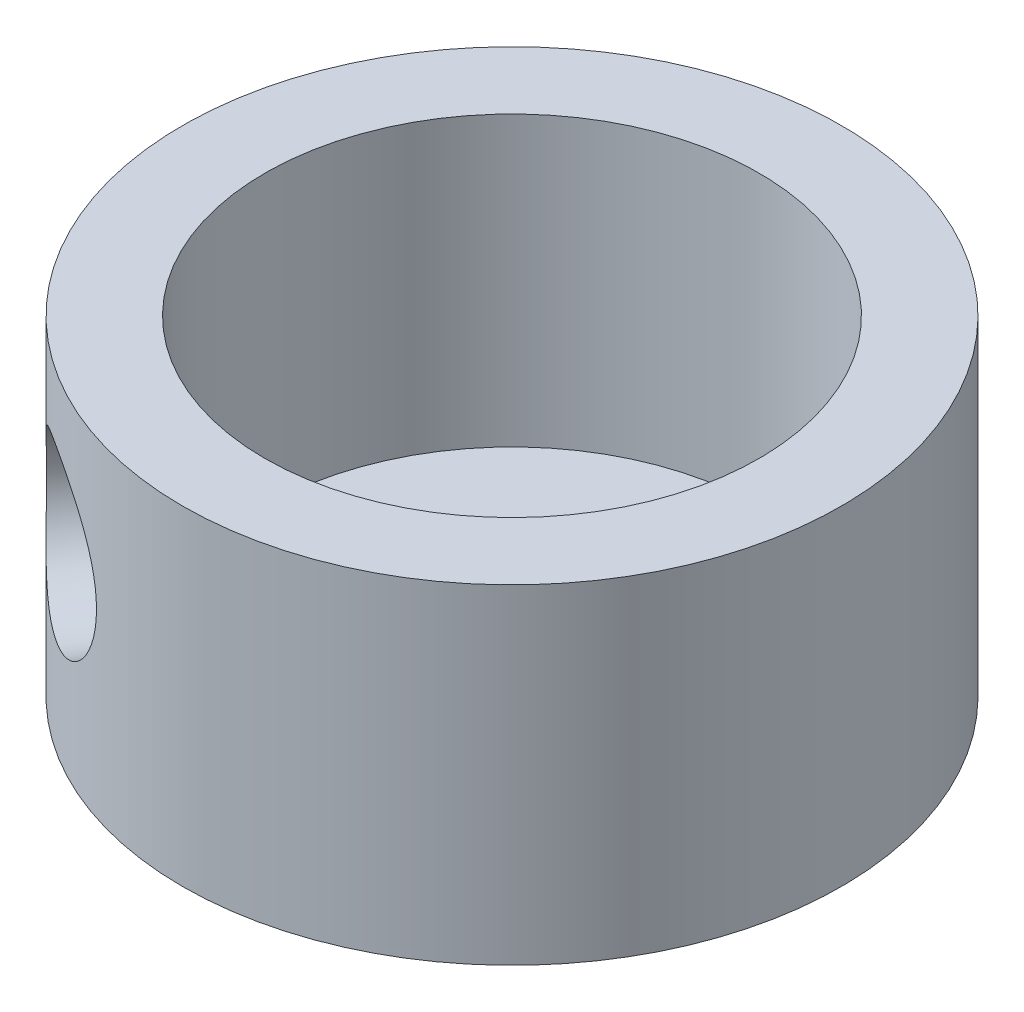
ISO-10303-21;
HEADER;
FILE_DESCRIPTION(('STEP AP214'),'2;1');
FILE_NAME('part.step','',(''),(''),'','','');
FILE_SCHEMA(('AUTOMOTIVE_DESIGN { 1 0 10303 214 1 1 1 1 }'));
ENDSEC;
DATA;
#1=APPLICATION_CONTEXT('core data for automotive mechanical design processes');
#2=APPLICATION_PROTOCOL_DEFINITION('international standard','automotive_design',2000,#1);
#3=PRODUCT_CONTEXT('',#1,'mechanical');
#4=PRODUCT('Part','Part','',(#3));
#5=PRODUCT_RELATED_PRODUCT_CATEGORY('part','',(#4));
#6=PRODUCT_DEFINITION_FORMATION('','',#4);
#7=PRODUCT_DEFINITION_CONTEXT('part definition',#1,'design');
#8=PRODUCT_DEFINITION('design','',#6,#7);
#9=PRODUCT_DEFINITION_SHAPE('','',#8);
#10=(LENGTH_UNIT() NAMED_UNIT(*) SI_UNIT(.MILLI.,.METRE.));
#11=(NAMED_UNIT(*) PLANE_ANGLE_UNIT() SI_UNIT($,.RADIAN.));
#12=(NAMED_UNIT(*) SI_UNIT($,.STERADIAN.) SOLID_ANGLE_UNIT());
#13=UNCERTAINTY_MEASURE_WITH_UNIT(LENGTH_MEASURE(1.E-05),#10,'distance_accuracy_value','');
#14=(GEOMETRIC_REPRESENTATION_CONTEXT(3) GLOBAL_UNCERTAINTY_ASSIGNED_CONTEXT((#13)) GLOBAL_UNIT_ASSIGNED_CONTEXT((#10,
#11,#12)) REPRESENTATION_CONTEXT('',''));
#15=CARTESIAN_POINT('',(0.,0.,0.));
#16=DIRECTION('',(0.,0.,1.));
#17=DIRECTION('',(1.,0.,0.));
#18=AXIS2_PLACEMENT_3D('',#15,#16,#17);
#19=CARTESIAN_POINT('',(0.,40.,0.));
#20=DIRECTION('',(0.,-1.,0.));
#21=DIRECTION('',(0.,0.,-1.));
#22=AXIS2_PLACEMENT_3D('',#19,#20,#21);
#23=CYLINDRICAL_SURFACE('',#22,40.);
#24=CARTESIAN_POINT('',(-12.415558049306,21.9418173695324,38.0243858375689));
#25=CARTESIAN_POINT('',(-12.4155594019558,21.6590399606591,38.024385824656));
#26=CARTESIAN_POINT('',(-12.427079223235,21.376240105265,38.0206299008439));
#27=CARTESIAN_POINT('',(-12.4730260124529,20.8126929271854,38.0055811007373));
#28=CARTESIAN_POINT('',(-12.5074554293318,20.5319458271749,37.9942874186875));
#29=CARTESIAN_POINT('',(-12.5988361564139,19.9744217554529,37.9640835670639));
#30=CARTESIAN_POINT('',(-12.6557980052463,19.6976467043668,37.945169833444));
#31=CARTESIAN_POINT('',(-12.7915879181901,19.1501618869632,37.8996094838355));
#32=CARTESIAN_POINT('',(-12.8704165418517,18.8794522760463,37.8729626699637));
#33=CARTESIAN_POINT('',(-13.0489388759586,18.346338890214,37.8118245383458));
#34=CARTESIAN_POINT('',(-13.1486037211899,18.0839241970142,37.7773440671934));
#35=CARTESIAN_POINT('',(-13.3678065925695,17.5687586196163,37.7003346469411));
#36=CARTESIAN_POINT('',(-13.487344713083,17.3160077813125,37.6578056596238));
#37=CARTESIAN_POINT('',(-13.7450691457293,16.8218384424075,37.5645024376086));
#38=CARTESIAN_POINT('',(-13.8832528767622,16.580418379518,37.5137293439394));
#39=CARTESIAN_POINT('',(-14.1770036319947,16.1103180981837,37.4037052401701));
#40=CARTESIAN_POINT('',(-14.3325764192147,15.8816421411985,37.3444514175807));
#41=CARTESIAN_POINT('',(-14.6630368258013,15.4339465137954,37.2159564763509));
#42=CARTESIAN_POINT('',(-14.8382576138213,15.2152247331983,37.146534002738));
#43=CARTESIAN_POINT('',(-15.2036988504105,14.7940372077944,36.9984648293445));
#44=CARTESIAN_POINT('',(-15.3939194680408,14.5915716462611,36.9198180255927));
#45=CARTESIAN_POINT('',(-15.7877471353374,14.2041698809787,36.7531326951415));
#46=CARTESIAN_POINT('',(-15.9913578206036,14.0192384715667,36.6650916136847));
#47=CARTESIAN_POINT('',(-16.4101096230142,13.6682740600851,36.4795931386337));
#48=CARTESIAN_POINT('',(-16.6252466706628,13.5022344519136,36.382139058762));
#49=CARTESIAN_POINT('',(-17.068609899895,13.18780542268,36.1762790752024));
#50=CARTESIAN_POINT('',(-17.2969835423152,13.0397165135677,36.0677313896055));
#51=CARTESIAN_POINT('',(-17.7618872048861,12.7652362770315,35.8410690588175));
#52=CARTESIAN_POINT('',(-17.9984173294578,12.6388452275117,35.7229542911206));
#53=CARTESIAN_POINT('',(-18.4776036586333,12.4087760698445,35.4774663042957));
#54=CARTESIAN_POINT('',(-18.7202591245734,12.3050952374945,35.3500941980752));
#55=CARTESIAN_POINT('',(-19.209675688444,12.1212903963853,35.0865443154229));
#56=CARTESIAN_POINT('',(-19.4564366858053,12.0411658114867,34.9503667544547));
#57=CARTESIAN_POINT('',(-19.9467336690578,11.9066098239185,34.6728348559678));
#58=CARTESIAN_POINT('',(-20.190226874615,11.851668979168,34.531651842159));
#59=CARTESIAN_POINT('',(-20.6772330186998,11.7654877838205,34.2422583409081));
#60=CARTESIAN_POINT('',(-20.9207459569345,11.7342471296421,34.0940479435072));
#61=CARTESIAN_POINT('',(-21.4058594618598,11.6957430998773,33.791579944348));
#62=CARTESIAN_POINT('',(-21.6474602820483,11.6884764909653,33.6373231608919));
#63=CARTESIAN_POINT('',(-22.1269515595027,11.697976277523,33.3238661051776));
#64=CARTESIAN_POINT('',(-22.3648420652796,11.714742358507,33.1646658976343));
#65=CARTESIAN_POINT('',(-22.8296912331943,11.7714865615309,32.846349876943));
#66=CARTESIAN_POINT('',(-23.0567754522229,11.8109137597068,32.68731882579));
#67=CARTESIAN_POINT('',(-23.5042655720258,11.9122192033553,32.3670388971039));
#68=CARTESIAN_POINT('',(-23.7246715944038,11.9740970397557,32.2057900600325));
#69=CARTESIAN_POINT('',(-24.157462349507,12.1198049321382,31.8824401309598));
#70=CARTESIAN_POINT('',(-24.3698468116334,12.2036357279238,31.7203390104175));
#71=CARTESIAN_POINT('',(-24.7853844276538,12.3925941893316,31.3967208213953));
#72=CARTESIAN_POINT('',(-24.9885374448385,12.4977221702199,31.2352037615976));
#73=CARTESIAN_POINT('',(-25.3863704114685,12.7295467767607,30.9127540813596));
#74=CARTESIAN_POINT('',(-25.580955575286,12.8564323543292,30.7518404033818));
#75=CARTESIAN_POINT('',(-25.9587773131162,13.1302188347266,30.4335821563262));
#76=CARTESIAN_POINT('',(-26.1420096394612,13.2771271640767,30.2762389369247));
#77=CARTESIAN_POINT('',(-26.4961994554797,13.589864622714,29.9667601859793));
#78=CARTESIAN_POINT('',(-26.6671600334844,13.7556889641705,29.8146233492661));
#79=CARTESIAN_POINT('',(-26.9962465907019,14.1052654857866,29.5169769115408));
#80=CARTESIAN_POINT('',(-27.154366634197,14.2890258716803,29.3714703889715));
#81=CARTESIAN_POINT('',(-27.4614067566622,14.6787015029998,29.08464419284));
#82=CARTESIAN_POINT('',(-27.6099373688576,14.8850981540838,28.9435612338078));
#83=CARTESIAN_POINT('',(-27.8920985323562,15.3140800578754,28.6717493252709));
#84=CARTESIAN_POINT('',(-28.0257355159879,15.5366582528584,28.5410159130784));
#85=CARTESIAN_POINT('',(-28.2777685087586,15.9967376171682,28.2913290555826));
#86=CARTESIAN_POINT('',(-28.3961571707081,16.2342458989409,28.1723812953512));
#87=CARTESIAN_POINT('',(-28.6171538236737,16.7224292363785,27.9478678974231));
#88=CARTESIAN_POINT('',(-28.7197679983991,16.973099080656,27.8422970187622));
#89=CARTESIAN_POINT('',(-28.9094262196698,17.4874392699427,27.6453229921858));
#90=CARTESIAN_POINT('',(-28.9963807245355,17.7511740261051,27.5540016964479));
#91=CARTESIAN_POINT('',(-29.1536859694589,18.2885173631422,27.3875103275779));
#92=CARTESIAN_POINT('',(-29.2240365966865,18.5621260110993,27.3123403642009));
#93=CARTESIAN_POINT('',(-29.3478425020016,19.1171995118521,27.1792642996862));
#94=CARTESIAN_POINT('',(-29.4013009146835,19.3986628965256,27.121354995697));
#95=CARTESIAN_POINT('',(-29.4911162413284,19.9674036926432,27.023665103353));
#96=CARTESIAN_POINT('',(-29.5274736324144,20.2546809416457,26.9838840092176));
#97=CARTESIAN_POINT('',(-29.5821625968912,20.8248479548057,26.9239160409514));
#98=CARTESIAN_POINT('',(-29.6009656796506,21.1076387618925,26.9032168318557));
#99=CARTESIAN_POINT('',(-29.6221793637466,21.6745754436535,26.8798575612291));
#100=CARTESIAN_POINT('',(-29.6245902664415,21.9587212933202,26.8771971680678));
#101=CARTESIAN_POINT('',(-29.6130102894667,22.5262447741513,26.88995526145));
#102=CARTESIAN_POINT('',(-29.5990208785768,22.8096224718319,26.9053721290297));
#103=CARTESIAN_POINT('',(-29.5547018725208,23.3735511571288,26.9540475177789));
#104=CARTESIAN_POINT('',(-29.524372355573,23.6541021582696,26.9873059535428));
#105=CARTESIAN_POINT('',(-29.4481701318988,24.2054902938224,27.0704338614228));
#106=CARTESIAN_POINT('',(-29.4025776436252,24.4764115078107,27.1200036066114));
#107=CARTESIAN_POINT('',(-29.2959159573617,25.0117094727553,27.2351879483556));
#108=CARTESIAN_POINT('',(-29.2348469881162,25.2760863203749,27.300802307769));
#109=CARTESIAN_POINT('',(-29.0974634676786,25.7965225291535,27.4471799097561));
#110=CARTESIAN_POINT('',(-29.0211502667563,26.0525826246415,27.5279418105857));
#111=CARTESIAN_POINT('',(-28.8535123402745,26.5548603548175,27.7036019676224));
#112=CARTESIAN_POINT('',(-28.7621818777221,26.8010741831054,27.7985056250519));
#113=CARTESIAN_POINT('',(-28.5628552000875,27.2868517597766,28.0032876414242));
#114=CARTESIAN_POINT('',(-28.454561153977,27.5261826897104,28.1134284332626));
#115=CARTESIAN_POINT('',(-28.2230141718324,27.991476874443,28.345870669599));
#116=CARTESIAN_POINT('',(-28.0997544913729,28.2174340334654,28.4681775923749));
#117=CARTESIAN_POINT('',(-27.8387144478598,28.6544761944164,28.72349743814));
#118=CARTESIAN_POINT('',(-27.7009318742452,28.8655589240936,28.8565119902304));
#119=CARTESIAN_POINT('',(-27.4114046434103,29.271392365678,29.1316795971967));
#120=CARTESIAN_POINT('',(-27.2596660122815,29.4661500577904,29.2738286999463));
#121=CARTESIAN_POINT('',(-26.9384590331855,29.8431953786267,29.569720431772));
#122=CARTESIAN_POINT('',(-26.7686235346934,30.025006584294,29.7236720747458));
#123=CARTESIAN_POINT('',(-26.4155201118069,30.3688630378871,30.0379114434828));
#124=CARTESIAN_POINT('',(-26.2322571901353,30.5309155880461,30.1981967993121));
#125=CARTESIAN_POINT('',(-25.8530319694061,30.834183337589,30.523485104556));
#126=CARTESIAN_POINT('',(-25.6570675867629,30.9753951056748,30.6884888254917));
#127=CARTESIAN_POINT('',(-25.2534366352826,31.2358713328868,31.0214824908019));
#128=CARTESIAN_POINT('',(-25.0457702463975,31.3551361293908,31.1894723892281));
#129=CARTESIAN_POINT('',(-24.6214514963241,31.5699629398362,31.5254946326937));
#130=CARTESIAN_POINT('',(-24.4048775360613,31.6656947919072,31.693517352513));
#131=CARTESIAN_POINT('',(-23.9625908732256,31.8338075893396,32.0292258376295));
#132=CARTESIAN_POINT('',(-23.7368781887408,31.9061885809162,32.1969116035928));
#133=CARTESIAN_POINT('',(-23.2778036421897,32.0269661580589,32.5303600242659));
#134=CARTESIAN_POINT('',(-23.0444430837084,32.0753668086534,32.6961230002617));
#135=CARTESIAN_POINT('',(-22.5716518700038,32.1477713359274,33.0242838850768));
#136=CARTESIAN_POINT('',(-22.3322213556877,32.1717757784072,33.1866818718518));
#137=CARTESIAN_POINT('',(-21.8559144432038,32.1948409272521,33.5022131687972));
#138=CARTESIAN_POINT('',(-21.6191586730003,32.1945907809763,33.655478612242));
#139=CARTESIAN_POINT('',(-21.14329339905,32.1708613280812,33.9564485366402));
#140=CARTESIAN_POINT('',(-20.904183942973,32.1473824909639,34.1041531299277));
#141=CARTESIAN_POINT('',(-20.425408744215,32.0773979419336,34.3930349023032));
#142=CARTESIAN_POINT('',(-20.1857430227841,32.0308930956912,34.5342123265642));
#143=CARTESIAN_POINT('',(-19.7076771875387,31.9152465383011,34.8092446389114));
#144=CARTESIAN_POINT('',(-19.4692770794112,31.8461047255214,34.9430994941187));
#145=CARTESIAN_POINT('',(-18.9970437698956,31.6862394453518,35.2020511789302));
#146=CARTESIAN_POINT('',(-18.763191527657,31.5956509269002,35.3271966829144));
#147=CARTESIAN_POINT('',(-18.3002772869646,31.3933339481907,35.5692015291471));
#148=CARTESIAN_POINT('',(-18.0712170524223,31.2815978505519,35.6860578567598));
#149=CARTESIAN_POINT('',(-17.6197666056469,31.0378455910436,35.9111046958463));
#150=CARTESIAN_POINT('',(-17.3973757369665,30.9058314329699,36.0192960619511));
#151=CARTESIAN_POINT('',(-16.9609564922898,30.6224407821139,36.2268457480337));
#152=CARTESIAN_POINT('',(-16.7469285219122,30.4710633516889,36.3262036398663));
#153=CARTESIAN_POINT('',(-16.3236970613064,30.1459575469386,36.5183826835013));
#154=CARTESIAN_POINT('',(-16.1147473754926,29.9717655579183,36.610978744328));
#155=CARTESIAN_POINT('',(-15.7091437497528,29.6052951968311,36.7868410710465));
#156=CARTESIAN_POINT('',(-15.5124899944406,29.4130165533159,36.8701071968713));
#157=CARTESIAN_POINT('',(-15.1331093491303,29.0115842713451,37.0274383704973));
#158=CARTESIAN_POINT('',(-14.9503860672027,28.8024262897283,37.1015010376592));
#159=CARTESIAN_POINT('',(-14.6005401171245,28.3686312573821,37.2405648581433));
#160=CARTESIAN_POINT('',(-14.4334171502865,28.1439945031563,37.305566184968));
#161=CARTESIAN_POINT('',(-14.1131122798953,27.6760104452757,37.4279314555025));
#162=CARTESIAN_POINT('',(-13.9602783837288,27.4323776873657,37.4851154913426));
#163=CARTESIAN_POINT('',(-13.6740291181351,26.9322224548289,37.5904800700274));
#164=CARTESIAN_POINT('',(-13.5406066430753,26.6757047432843,37.6386639092749));
#165=CARTESIAN_POINT('',(-13.2945761788748,26.1515679270335,37.7262680080811));
#166=CARTESIAN_POINT('',(-13.1819595387187,25.883953493249,37.7656919113882));
#167=CARTESIAN_POINT('',(-12.9787388973049,25.3394307916469,37.8360134750638));
#168=CARTESIAN_POINT('',(-12.8881316712521,25.062523892126,37.8669123845951));
#169=CARTESIAN_POINT('',(-12.7442001262032,24.5519100109232,37.9155644857032));
#170=CARTESIAN_POINT('',(-12.6871014557972,24.3193880061691,37.9346823929567));
#171=CARTESIAN_POINT('',(-12.5888717806385,23.8506176496831,37.9673938431839));
#172=CARTESIAN_POINT('',(-12.5477396558224,23.614369560549,37.9809877736713));
#173=CARTESIAN_POINT('',(-12.4817852584319,23.1393368779819,38.0027136536098));
#174=CARTESIAN_POINT('',(-12.4569643911473,22.9005520677992,38.010845132447));
#175=CARTESIAN_POINT('',(-12.4238524640314,22.4217891223431,38.0216804906382));
#176=CARTESIAN_POINT('',(-12.4155569013085,22.1818113300111,38.0243858485282));
#177=CARTESIAN_POINT('',(-12.415558049306,21.9418173695324,38.0243858375689));
#178=B_SPLINE_CURVE_WITH_KNOTS('',3,(#24,#25,#26,#27,#28,#29,#30,#31,#32,#33,#34,#35,#36,#37,
#38,#39,#40,#41,#42,#43,#44,#45,#46,#47,#48,#49,#50,#51,#52,#53,#54,#55,#56,#57,#58,#59,#60,#61,
#62,#63,#64,#65,#66,#67,#68,#69,#70,#71,#72,#73,#74,#75,#76,#77,#78,#79,#80,#81,#82,#83,#84,#85,
#86,#87,#88,#89,#90,#91,#92,#93,#94,#95,#96,#97,#98,#99,#100,#101,#102,#103,#104,#105,#106,#107,
#108,#109,#110,#111,#112,#113,#114,#115,#116,#117,#118,#119,#120,#121,#122,#123,#124,#125,#126,
#127,#128,#129,#130,#131,#132,#133,#134,#135,#136,#137,#138,#139,#140,#141,#142,#143,#144,#145,
#146,#147,#148,#149,#150,#151,#152,#153,#154,#155,#156,#157,#158,#159,#160,#161,#162,#163,#164,
#165,#166,#167,#168,#169,#170,#171,#172,#173,#174,#175,#176,#177),.UNSPECIFIED.,.T.,.F.,(4,2,2,
2,2,2,2,2,2,2,2,2,2,2,2,2,2,2,2,2,2,2,2,2,2,2,2,2,2,2,2,2,2,2,2,2,2,2,2,2,2,2,2,2,2,2,2,2,2,2,2,
2,2,2,2,2,2,2,2,2,2,2,2,2,2,2,2,2,2,2,2,2,2,2,2,2,4),(0.,0.848112593345659,1.69631586095413,
2.54491631111931,3.39353847817868,4.24099271562359,5.08845097718756,5.93579204577349,
6.78341477452493,7.64858415044162,8.51376327895477,9.37917829397946,10.2442897537628,
11.122316700621,12.000354892326,12.8782877012619,13.756199035908,14.6154688074595,
15.4747275722339,16.3338704459717,17.1930020772866,18.0320808097682,18.8711442541987,
19.7102359782815,20.5493401244988,21.3961391778563,22.243253171559,23.0901532260631,
23.9374425695264,24.8088254212288,25.6798304656784,26.5512536340158,27.4223343224541,
28.2982477724402,29.1741671744398,30.0499239413562,30.9256562729853,31.777125848367,
32.6285797700681,33.4799574430579,34.3313310406315,35.1678607653741,36.0043781268131,
36.8408214258946,37.6775850141307,38.5311513137805,39.3851037201627,40.2391862967037,
41.0929018045883,41.9695841099636,42.8459414302442,43.7224428764281,44.5989308475501,
45.4688941042087,46.3388556390546,47.2086696518341,48.0784634913037,48.9235512655474,
49.7686219590874,50.6136608843216,51.4587036035312,52.2985641288976,53.1387285480002,
53.9788099988056,54.818932144933,55.680026211098,56.5411332028148,57.4024624736463,
58.2637752498716,59.1424117793726,60.0207258666367,60.898673927058,61.7764932738004,
62.4964734644741,63.2164031389443,63.9363948305442,64.6561903086195),.UNSPECIFIED.);
#179=CARTESIAN_POINT('',(-12.415558049306,21.9418173695324,38.0243858375689));
#180=VERTEX_POINT('',#179);
#181=EDGE_CURVE('E47',#180,#180,#178,.T.);
#182=ORIENTED_EDGE('',*,*,#181,.T.);
#183=EDGE_LOOP('',(#182));
#184=FACE_BOUND('',#183,.T.);
#185=CARTESIAN_POINT('',(0.,40.,0.));
#186=DIRECTION('',(0.,1.,0.));
#187=DIRECTION('',(0.,0.,1.));
#188=AXIS2_PLACEMENT_3D('',#185,#186,#187);
#189=CIRCLE('',#188,40.);
#190=CARTESIAN_POINT('',(0.,40.,40.));
#191=VERTEX_POINT('',#190);
#192=EDGE_CURVE('E10',#191,#191,#189,.T.);
#193=ORIENTED_EDGE('',*,*,#192,.F.);
#194=EDGE_LOOP('',(#193));
#195=FACE_BOUND('',#194,.T.);
#196=CARTESIAN_POINT('',(0.,0.,0.));
#197=DIRECTION('',(0.,1.,0.));
#198=DIRECTION('',(0.,0.,1.));
#199=AXIS2_PLACEMENT_3D('',#196,#197,#198);
#200=CIRCLE('',#199,40.);
#201=CARTESIAN_POINT('',(0.,0.,40.));
#202=VERTEX_POINT('',#201);
#203=EDGE_CURVE('E35',#202,#202,#200,.T.);
#204=ORIENTED_EDGE('',*,*,#203,.T.);
#205=EDGE_LOOP('',(#204));
#206=FACE_BOUND('',#205,.T.);
#207=ADVANCED_FACE('F31',(#184,#195,#206),#23,.T.);
#208=CARTESIAN_POINT('',(0.,40.,0.));
#209=DIRECTION('',(0.,1.,0.));
#210=DIRECTION('',(0.,0.,1.));
#211=AXIS2_PLACEMENT_3D('',#208,#209,#210);
#212=PLANE('',#211);
#213=CARTESIAN_POINT('',(0.,40.,0.));
#214=DIRECTION('',(0.,1.,0.));
#215=DIRECTION('',(0.,0.,1.));
#216=AXIS2_PLACEMENT_3D('',#213,#214,#215);
#217=CIRCLE('',#216,30.);
#218=CARTESIAN_POINT('',(0.,40.,30.));
#219=VERTEX_POINT('',#218);
#220=EDGE_CURVE('E44',#219,#219,#217,.T.);
#221=ORIENTED_EDGE('',*,*,#220,.F.);
#222=EDGE_LOOP('',(#221));
#223=FACE_BOUND('',#222,.T.);
#224=ORIENTED_EDGE('',*,*,#192,.T.);
#225=EDGE_LOOP('',(#224));
#226=FACE_BOUND('',#225,.T.);
#227=ADVANCED_FACE('F77',(#223,#226),#212,.T.);
#228=CARTESIAN_POINT('',(0.,0.,0.));
#229=DIRECTION('',(0.,1.,0.));
#230=DIRECTION('',(0.,0.,1.));
#231=AXIS2_PLACEMENT_3D('',#228,#229,#230);
#232=PLANE('',#231);
#233=ORIENTED_EDGE('',*,*,#203,.F.);
#234=EDGE_LOOP('',(#233));
#235=FACE_BOUND('',#234,.T.);
#236=ADVANCED_FACE('F75',(#235),#232,.F.);
#237=CARTESIAN_POINT('',(0.,5.,0.));
#238=DIRECTION('',(0.,1.,0.));
#239=DIRECTION('',(0.,0.,1.));
#240=AXIS2_PLACEMENT_3D('',#237,#238,#239);
#241=CYLINDRICAL_SURFACE('',#240,30.);
#242=CARTESIAN_POINT('',(-6.72398414680923,21.9418173695324,29.2367583222466));
#243=CARTESIAN_POINT('',(-6.72398373072931,22.2205147637555,29.2367582753563));
#244=CARTESIAN_POINT('',(-6.73578490035575,22.499207373839,29.2340518208729));
#245=CARTESIAN_POINT('',(-6.78281727749235,23.0544938832611,29.2231752358608));
#246=CARTESIAN_POINT('',(-6.81804797693587,23.3310878279775,29.2150052238086));
#247=CARTESIAN_POINT('',(-6.91144440697164,23.8801689689856,29.1930510602252));
#248=CARTESIAN_POINT('',(-6.96961227976593,24.1526557792257,29.1792663843121));
#249=CARTESIAN_POINT('',(-7.10809180437332,24.6915709231389,29.1458418258172));
#250=CARTESIAN_POINT('',(-7.18840373425956,24.9579991806865,29.1262018697076));
#251=CARTESIAN_POINT('',(-7.36993050789719,25.4824036723933,29.0807986043421));
#252=CARTESIAN_POINT('',(-7.47109725863044,25.7403977979091,29.0550493633589));
#253=CARTESIAN_POINT('',(-7.69327771739178,26.2470363668414,28.9970111650231));
#254=CARTESIAN_POINT('',(-7.81429879598078,26.4956772957536,28.9647197779671));
#255=CARTESIAN_POINT('',(-8.07481937033553,26.9820199188631,28.8931744454563));
#256=CARTESIAN_POINT('',(-8.21431842803777,27.2197218722144,28.8539206650539));
#257=CARTESIAN_POINT('',(-8.51037867359708,27.6828514014867,28.7679892899678));
#258=CARTESIAN_POINT('',(-8.66694093424509,27.9082782043115,28.7213112284229));
#259=CARTESIAN_POINT('',(-9.00178379202277,28.3537677891746,28.6181708681804));
#260=CARTESIAN_POINT('',(-9.18065716073075,28.5733157504893,28.5614082454308));
#261=CARTESIAN_POINT('',(-9.55346478597951,28.99653972894,28.4388783756621));
#262=CARTESIAN_POINT('',(-9.74739934315302,29.2002154290909,28.3731109488803));
#263=CARTESIAN_POINT('',(-10.1486238114222,29.5904902805601,28.2320854789264));
#264=CARTESIAN_POINT('',(-10.3559161685286,29.7770862891063,28.1568256951343));
#265=CARTESIAN_POINT('',(-10.7820271655895,30.131960778289,27.9964231121063));
#266=CARTESIAN_POINT('',(-11.0008454583122,30.3002398102774,27.9112806105055));
#267=CARTESIAN_POINT('',(-11.4544153763154,30.6217636210265,27.7282853940341));
#268=CARTESIAN_POINT('',(-11.68944113191,30.7744584736251,27.6301445093712));
#269=CARTESIAN_POINT('',(-12.1675633559733,31.0580386530881,27.4229511064658));
#270=CARTESIAN_POINT('',(-12.4106565829688,31.1889326152084,27.3139029360862));
#271=CARTESIAN_POINT('',(-12.9028534476626,31.4278737062776,27.0848673627461));
#272=CARTESIAN_POINT('',(-13.1519570281554,31.5359210525811,26.9648800638723));
#273=CARTESIAN_POINT('',(-13.6539495576696,31.7281714458344,26.7141975373135));
#274=CARTESIAN_POINT('',(-13.906838335156,31.812375569871,26.5835027936676));
#275=CARTESIAN_POINT('',(-14.4048954596895,31.9534949328888,26.3168359463481));
#276=CARTESIAN_POINT('',(-14.650009700479,32.0112920437019,26.1812291902398));
#277=CARTESIAN_POINT('',(-15.1396099911967,32.1034204724705,25.9011916312424));
#278=CARTESIAN_POINT('',(-15.3840960548938,32.1377523092041,25.756761023511));
#279=CARTESIAN_POINT('',(-15.8703756072581,32.1825999466466,25.4600135833959));
#280=CARTESIAN_POINT('',(-16.1121697085366,32.1931212809146,25.3076985917609));
#281=CARTESIAN_POINT('',(-16.591195144581,32.1902557512463,24.9962766714749));
#282=CARTESIAN_POINT('',(-16.8284265908409,32.1768694722732,24.8371699090957));
#283=CARTESIAN_POINT('',(-17.2868713245513,32.127372361667,24.5201657585162));
#284=CARTESIAN_POINT('',(-17.5083417224674,32.0922215240218,24.3624891280216));
#285=CARTESIAN_POINT('',(-17.9440047537916,32.0003994369741,24.043410608761));
#286=CARTESIAN_POINT('',(-18.1581976232302,31.9437288862429,23.8820088410972));
#287=CARTESIAN_POINT('',(-18.5780556731441,31.8093682937432,23.5568749334761));
#288=CARTESIAN_POINT('',(-18.7837205376926,31.7316774740626,23.3931427074865));
#289=CARTESIAN_POINT('',(-19.1854407528716,31.5559309194817,23.0648252946948));
#290=CARTESIAN_POINT('',(-19.3814958826316,31.4578747167738,22.9002400883839));
#291=CARTESIAN_POINT('',(-19.7656284241115,31.2407414104173,22.5695594469782));
#292=CARTESIAN_POINT('',(-19.953565644322,31.1214029013913,22.4034729108075));
#293=CARTESIAN_POINT('',(-20.3179653187186,30.8634649667782,22.0735300672441));
#294=CARTESIAN_POINT('',(-20.4944235861945,30.7248585708084,21.9096745906223));
#295=CARTESIAN_POINT('',(-20.8352096771023,30.4293752078029,21.5858586782366));
#296=CARTESIAN_POINT('',(-20.9995369845054,30.2724974642684,21.4258984083614));
#297=CARTESIAN_POINT('',(-21.3156047661869,29.941480625721,21.1114825479554));
#298=CARTESIAN_POINT('',(-21.4673444888609,29.7673405013322,20.9570272864422));
#299=CARTESIAN_POINT('',(-21.7650501984461,29.3938539219344,20.6477820099254));
#300=CARTESIAN_POINT('',(-21.9103621097202,29.1936877972574,20.4933513451098));
#301=CARTESIAN_POINT('',(-22.1864198238598,28.7767620320094,20.194162994111));
#302=CARTESIAN_POINT('',(-22.3171651941276,28.560001898951,20.0494055952561));
#303=CARTESIAN_POINT('',(-22.5638626800854,28.1111643139983,19.7713595525794));
#304=CARTESIAN_POINT('',(-22.6798118628933,27.8790838391148,19.6380731842307));
#305=CARTESIAN_POINT('',(-22.8966684643929,27.4010626661872,19.3847975582583));
#306=CARTESIAN_POINT('',(-22.9975765454384,27.1551225791263,19.264807715165));
#307=CARTESIAN_POINT('',(-23.1856556676519,26.6468667240863,19.0380520761182));
#308=CARTESIAN_POINT('',(-23.2725817772915,26.3843522540815,18.9315278847804));
#309=CARTESIAN_POINT('',(-23.4304931965749,25.8484455226063,18.7357362578671));
#310=CARTESIAN_POINT('',(-23.5014851366201,25.5750578415667,18.646461646692));
#311=CARTESIAN_POINT('',(-23.627387938035,25.019281329195,18.4866680720593));
#312=CARTESIAN_POINT('',(-23.6823011887297,24.7368938421743,18.416146322033));
#313=CARTESIAN_POINT('',(-23.7759006184261,24.165219828334,18.2951473249879));
#314=CARTESIAN_POINT('',(-23.8145876856504,23.8759336800639,18.2446689807995));
#315=CARTESIAN_POINT('',(-23.8741747612712,23.3065206167073,18.1666196852638));
#316=CARTESIAN_POINT('',(-23.8958271877043,23.0266046603441,18.1380811724056));
#317=CARTESIAN_POINT('',(-23.9242215250056,22.464712771264,18.1006128040455));
#318=CARTESIAN_POINT('',(-23.9309639040735,22.1827369035106,18.0916823328192));
#319=CARTESIAN_POINT('',(-23.9295168027067,21.6189413044954,18.0935962555302));
#320=CARTESIAN_POINT('',(-23.9213298984734,21.337121554688,18.1044372376997));
#321=CARTESIAN_POINT('',(-23.8900560816747,20.7757544533683,18.1456851161155));
#322=CARTESIAN_POINT('',(-23.866969370316,20.4962070712216,18.1760917481476));
#323=CARTESIAN_POINT('',(-23.8070990734116,19.95175460644,18.2544339494058));
#324=CARTESIAN_POINT('',(-23.7708536865888,19.6866903840635,18.3016795669267));
#325=CARTESIAN_POINT('',(-23.6846961192658,19.1622962704652,18.4130421756515));
#326=CARTESIAN_POINT('',(-23.6347791084493,18.9029684410299,18.4771651294676));
#327=CARTESIAN_POINT('',(-23.5214183516672,18.3918583275809,18.6212585716463));
#328=CARTESIAN_POINT('',(-23.4579777879773,18.1400742842819,18.7012253314344));
#329=CARTESIAN_POINT('',(-23.3176722606503,17.6454060802797,18.8758762402659));
#330=CARTESIAN_POINT('',(-23.2408021027341,17.402525407346,18.9705660823174));
#331=CARTESIAN_POINT('',(-23.071082438089,16.9194176078902,19.1766404737065));
#332=CARTESIAN_POINT('',(-22.9777948861275,16.6795331140867,19.2884674989938));
#333=CARTESIAN_POINT('',(-22.7772039305946,16.212120773582,19.5249333218702));
#334=CARTESIAN_POINT('',(-22.6698942597428,15.9845985170325,19.6495778429865));
#335=CARTESIAN_POINT('',(-22.4414670049885,15.5432944578777,19.9100617515478));
#336=CARTESIAN_POINT('',(-22.3203487190061,15.3295133547874,20.0459017081119));
#337=CARTESIAN_POINT('',(-22.0645175176582,14.9169028827445,20.3271542718111));
#338=CARTESIAN_POINT('',(-21.9298042637408,14.7180738863556,20.472567117306));
#339=CARTESIAN_POINT('',(-21.6397879644949,14.3267300216275,20.7789873101744));
#340=CARTESIAN_POINT('',(-21.4837836715573,14.1350604131378,20.9404119248902));
#341=CARTESIAN_POINT('',(-21.1574724759472,13.7708518153345,21.2700521116235));
#342=CARTESIAN_POINT('',(-20.9871707290401,13.5983059814838,21.4382652243929));
#343=CARTESIAN_POINT('',(-20.6326440709342,13.2734228418251,21.7796826217721));
#344=CARTESIAN_POINT('',(-20.4484136161576,13.1210936493383,21.9528888764862));
#345=CARTESIAN_POINT('',(-20.0668330683675,12.8379589918236,22.3022214060139));
#346=CARTESIAN_POINT('',(-19.8694885683427,12.7071444327266,22.478346412261));
#347=CARTESIAN_POINT('',(-19.4636819197503,12.4687670091456,22.8306118856057));
#348=CARTESIAN_POINT('',(-19.255292877308,12.3610704771757,23.0067460302071));
#349=CARTESIAN_POINT('',(-18.8273982885039,12.1689147922322,23.3582044557965));
#350=CARTESIAN_POINT('',(-18.6078927225189,12.0844556802794,23.5335287353543));
#351=CARTESIAN_POINT('',(-18.1591456053374,11.9396108901954,23.8814993960565));
#352=CARTESIAN_POINT('',(-17.9299071502095,11.8792176191833,24.0541466052801));
#353=CARTESIAN_POINT('',(-17.4631820205074,11.7830835021107,24.3950973408895));
#354=CARTESIAN_POINT('',(-17.2256957235416,11.747341529006,24.5634010655184));
#355=CARTESIAN_POINT('',(-16.7561082394725,11.7020272920308,24.8859387115725));
#356=CARTESIAN_POINT('',(-16.5243178027933,11.6912529533895,25.0404573494575));
#357=CARTESIAN_POINT('',(-16.0565600412529,11.6924272831364,25.3429367294646));
#358=CARTESIAN_POINT('',(-15.820592862574,11.7043751578182,25.4908977004668));
#359=CARTESIAN_POINT('',(-15.3462906854343,11.7508746983945,25.7792239096144));
#360=CARTESIAN_POINT('',(-15.1079558948681,11.7854243966516,25.9195898078093));
#361=CARTESIAN_POINT('',(-14.6307572466458,11.8767958297062,26.1919150705461));
#362=CARTESIAN_POINT('',(-14.3918933878982,11.9336176104912,26.3238744177296));
#363=CARTESIAN_POINT('',(-13.9197325937194,12.067814173064,26.5765211999669));
#364=CARTESIAN_POINT('',(-13.6864117724869,12.1448088168907,26.6973663810114));
#365=CARTESIAN_POINT('',(-13.2227826602285,12.3191676667589,26.9300077388896));
#366=CARTESIAN_POINT('',(-12.9924754717436,12.4165391178669,27.0418006774964));
#367=CARTESIAN_POINT('',(-12.5367241660946,12.6308581819914,27.256081103343));
#368=CARTESIAN_POINT('',(-12.3112797089558,12.7478044214088,27.3585692427401));
#369=CARTESIAN_POINT('',(-11.8669226177679,13.0004260253637,27.5542210000779));
#370=CARTESIAN_POINT('',(-11.6480104192178,13.1361026352587,27.6473839972911));
#371=CARTESIAN_POINT('',(-11.2101898858966,13.4307680384833,27.8278605460382));
#372=CARTESIAN_POINT('',(-10.9915989057494,13.5904476346834,27.9148164380263));
#373=CARTESIAN_POINT('',(-10.565015046123,13.9279125613163,28.0790438944361));
#374=CARTESIAN_POINT('',(-10.3570223844853,14.1056982636835,28.1563152598462));
#375=CARTESIAN_POINT('',(-9.9532954116297,14.4783101780896,28.3015539084982));
#376=CARTESIAN_POINT('',(-9.75756489542323,14.6731416213417,28.3695183189724));
#377=CARTESIAN_POINT('',(-9.38011364510451,15.0786274310168,28.496545902877));
#378=CARTESIAN_POINT('',(-9.19839281770163,15.2892816920571,28.5556091355827));
#379=CARTESIAN_POINT('',(-8.8432858594917,15.7343600987942,28.6676194500083));
#380=CARTESIAN_POINT('',(-8.67057032829238,15.9694109821349,28.720205472035));
#381=CARTESIAN_POINT('',(-8.3439971322297,16.4538111674429,28.8167782352512));
#382=CARTESIAN_POINT('',(-8.19013246860698,16.7031551120491,28.8607681715395));
#383=CARTESIAN_POINT('',(-7.90291602759611,17.2146468709714,28.9407351846676));
#384=CARTESIAN_POINT('',(-7.76956547117142,17.4767954461741,28.9767117846246));
#385=CARTESIAN_POINT('',(-7.52503507779392,18.0121245122762,29.0411750611466));
#386=CARTESIAN_POINT('',(-7.41385433338557,18.2853045510847,29.069662044292));
#387=CARTESIAN_POINT('',(-7.21796324990121,18.8328870650351,29.1189100486088));
#388=CARTESIAN_POINT('',(-7.13259183681824,19.1070353260787,29.1398672041068));
#389=CARTESIAN_POINT('',(-6.98533849665669,19.6619744371599,29.1755170705632));
#390=CARTESIAN_POINT('',(-6.92345609406928,19.9427651526061,29.1902099083364));
#391=CARTESIAN_POINT('',(-6.82408995095269,20.5087865616545,29.2135997082925));
#392=CARTESIAN_POINT('',(-6.78659807127452,20.7940157415691,29.2222986706967));
#393=CARTESIAN_POINT('',(-6.73654567784855,21.3667708043405,29.2338779332408));
#394=CARTESIAN_POINT('',(-6.72398457606191,21.654296632866,29.2367583706215));
#395=CARTESIAN_POINT('',(-6.72398414680923,21.9418173695324,29.2367583222466));
#396=B_SPLINE_CURVE_WITH_KNOTS('',3,(#242,#243,#244,#245,#246,#247,#248,#249,#250,#251,#252,
#253,#254,#255,#256,#257,#258,#259,#260,#261,#262,#263,#264,#265,#266,#267,#268,#269,#270,#271,
#272,#273,#274,#275,#276,#277,#278,#279,#280,#281,#282,#283,#284,#285,#286,#287,#288,#289,#290,
#291,#292,#293,#294,#295,#296,#297,#298,#299,#300,#301,#302,#303,#304,#305,#306,#307,#308,#309,
#310,#311,#312,#313,#314,#315,#316,#317,#318,#319,#320,#321,#322,#323,#324,#325,#326,#327,#328,
#329,#330,#331,#332,#333,#334,#335,#336,#337,#338,#339,#340,#341,#342,#343,#344,#345,#346,#347,
#348,#349,#350,#351,#352,#353,#354,#355,#356,#357,#358,#359,#360,#361,#362,#363,#364,#365,#366,
#367,#368,#369,#370,#371,#372,#373,#374,#375,#376,#377,#378,#379,#380,#381,#382,#383,#384,#385,
#386,#387,#388,#389,#390,#391,#392,#393,#394,#395),.UNSPECIFIED.,.T.,.F.,(4,2,2,2,2,2,2,2,2,2,2,
2,2,2,2,2,2,2,2,2,2,2,2,2,2,2,2,2,2,2,2,2,2,2,2,2,2,2,2,2,2,2,2,2,2,2,2,2,2,2,2,2,2,2,2,2,2,2,2,
2,2,2,2,2,2,2,2,2,2,2,2,2,2,2,2,2,4),(0.,0.835822477596541,1.67162683107072,2.50750926243164,
3.34340219083197,4.17738861992173,5.01168535492473,5.8459623145206,6.68029175673851,
7.54578336924178,8.41129226205546,9.27696009520511,10.1426018640312,11.032376620433,
11.9217980976817,12.8112111129036,13.7005839436224,14.5575784115751,15.4145539321952,
16.2713302713013,17.1280856473869,17.9495060268085,18.7708997398063,19.5923238548671,
20.4137668407222,21.2460981123185,22.078731276864,22.9113998397117,23.7441180854566,
24.6179145788048,25.49173701529,26.3657323916239,27.2396892690849,28.1275937203109,
29.0151280159188,29.902530355175,30.7898841116154,31.6354139301173,32.4809171972268,
33.3262745778512,34.1716205430184,34.9856992066468,35.8000658639515,36.6142411008451,
37.4287319432641,38.2696871011017,39.1110194234588,39.9523945412918,40.7937906168434,
41.678290082907,42.562471950924,43.4470075917591,44.3311683799208,45.2100704056516,
46.0889739828952,46.9676000421447,47.8461859284153,48.6815049129309,49.5167947195736,
50.3520118184202,51.1872306418393,52.0077198407346,52.8285012654717,53.6492251185848,
54.4700035668393,55.3220257337071,56.1740654062869,57.0263674870384,57.8786638918116,
58.7667562692626,59.6545179191006,60.5423323865199,61.4301105064223,62.2927202715121,
63.155312573098,64.0176168786667,64.8799008449406),.UNSPECIFIED.);
#397=CARTESIAN_POINT('',(-6.72398414680923,21.9418173695324,29.2367583222466));
#398=VERTEX_POINT('',#397);
#399=EDGE_CURVE('E56',#398,#398,#396,.T.);
#400=ORIENTED_EDGE('',*,*,#399,.T.);
#401=EDGE_LOOP('',(#400));
#402=FACE_BOUND('',#401,.T.);
#403=CARTESIAN_POINT('',(0.,5.,0.));
#404=DIRECTION('',(0.,1.,0.));
#405=DIRECTION('',(0.,0.,1.));
#406=AXIS2_PLACEMENT_3D('',#403,#404,#405);
#407=CIRCLE('',#406,30.);
#408=CARTESIAN_POINT('',(0.,5.,30.));
#409=VERTEX_POINT('',#408);
#410=EDGE_CURVE('E42',#409,#409,#407,.T.);
#411=ORIENTED_EDGE('',*,*,#410,.F.);
#412=EDGE_LOOP('',(#411));
#413=FACE_BOUND('',#412,.T.);
#414=ORIENTED_EDGE('',*,*,#220,.T.);
#415=EDGE_LOOP('',(#414));
#416=FACE_BOUND('',#415,.T.);
#417=ADVANCED_FACE('F71',(#402,#413,#416),#241,.F.);
#418=CARTESIAN_POINT('',(0.,5.,0.));
#419=DIRECTION('',(0.,1.,0.));
#420=DIRECTION('',(0.,0.,1.));
#421=AXIS2_PLACEMENT_3D('',#418,#419,#420);
#422=PLANE('',#421);
#423=ORIENTED_EDGE('',*,*,#410,.T.);
#424=EDGE_LOOP('',(#423));
#425=FACE_BOUND('',#424,.T.);
#426=ADVANCED_FACE('F64',(#425),#422,.T.);
#427=CARTESIAN_POINT('',(-21.7447581507004,21.9418173695324,33.5732854062207));
#428=DIRECTION('',(-0.543618953767509,0.,0.839332135155517));
#429=DIRECTION('',(0.839332135155517,0.,0.543618953767509));
#430=AXIS2_PLACEMENT_3D('',#427,#428,#429);
#431=CYLINDRICAL_SURFACE('',#430,10.25);
#432=ORIENTED_EDGE('',*,*,#399,.F.);
#433=EDGE_LOOP('',(#432));
#434=FACE_BOUND('',#433,.T.);
#435=ORIENTED_EDGE('',*,*,#181,.F.);
#436=EDGE_LOOP('',(#435));
#437=FACE_BOUND('',#436,.T.);
#438=ADVANCED_FACE('F61',(#434,#437),#431,.F.);
#439=CLOSED_SHELL('',(#207,#227,#236,#417,#426,#438));
#440=MANIFOLD_SOLID_BREP('B2',#439);
#441=ADVANCED_BREP_SHAPE_REPRESENTATION('',(#18,#440),#14);
#442=SHAPE_DEFINITION_REPRESENTATION(#9,#441);
ENDSEC;
END-ISO-10303-21;
